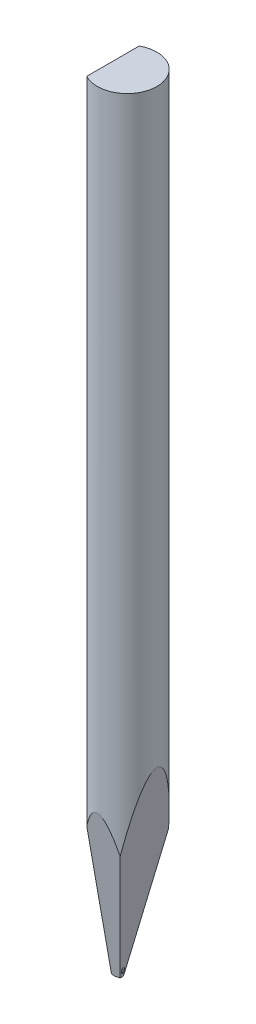
ISO-10303-21;
HEADER;
FILE_DESCRIPTION(('STEP AP214'),'2;1');
FILE_NAME('part.step','',(''),(''),'','','');
FILE_SCHEMA(('AUTOMOTIVE_DESIGN { 1 0 10303 214 1 1 1 1 }'));
ENDSEC;
DATA;
#1=APPLICATION_CONTEXT('core data for automotive mechanical design processes');
#2=APPLICATION_PROTOCOL_DEFINITION('international standard','automotive_design',2000,#1);
#3=PRODUCT_CONTEXT('',#1,'mechanical');
#4=PRODUCT('Part','Part','',(#3));
#5=PRODUCT_RELATED_PRODUCT_CATEGORY('part','',(#4));
#6=PRODUCT_DEFINITION_FORMATION('','',#4);
#7=PRODUCT_DEFINITION_CONTEXT('part definition',#1,'design');
#8=PRODUCT_DEFINITION('design','',#6,#7);
#9=PRODUCT_DEFINITION_SHAPE('','',#8);
#10=(LENGTH_UNIT() NAMED_UNIT(*) SI_UNIT(.MILLI.,.METRE.));
#11=(NAMED_UNIT(*) PLANE_ANGLE_UNIT() SI_UNIT($,.RADIAN.));
#12=(NAMED_UNIT(*) SI_UNIT($,.STERADIAN.) SOLID_ANGLE_UNIT());
#13=UNCERTAINTY_MEASURE_WITH_UNIT(LENGTH_MEASURE(1.E-05),#10,'distance_accuracy_value','');
#14=(GEOMETRIC_REPRESENTATION_CONTEXT(3) GLOBAL_UNCERTAINTY_ASSIGNED_CONTEXT((#13)) GLOBAL_UNIT_ASSIGNED_CONTEXT((#10,
#11,#12)) REPRESENTATION_CONTEXT('',''));
#15=CARTESIAN_POINT('',(0.,0.,0.));
#16=DIRECTION('',(0.,0.,1.));
#17=DIRECTION('',(1.,0.,0.));
#18=AXIS2_PLACEMENT_3D('',#15,#16,#17);
#19=CARTESIAN_POINT('',(26.8738719491216,0.,0.0381));
#20=DIRECTION('',(0.,-0.173648177666931,0.984807753012208));
#21=DIRECTION('',(0.,-0.984807753012208,-0.173648177666931));
#22=AXIS2_PLACEMENT_3D('',#19,#20,#21);
#23=PLANE('',#22);
#24=CARTESIAN_POINT('',(-0.3480816,0.02794,0.043026575840991));
#25=DIRECTION('',(0.,-0.173648177666931,0.984807753012208));
#26=DIRECTION('',(0.,-0.984807753012208,-0.173648177666931));
#27=AXIS2_PLACEMENT_3D('',#24,#25,#26);
#28=ELLIPSE('',#27,0.0283710195360877,0.02794);
#29=CARTESIAN_POINT('',(-0.3480816,0.,0.0380999999999965));
#30=VERTEX_POINT('',#29);
#31=CARTESIAN_POINT('',(-0.37592,0.0255594358987837,0.042606818160644));
#32=VERTEX_POINT('',#31);
#33=EDGE_CURVE('E533',#30,#32,#28,.F.);
#34=ORIENTED_EDGE('',*,*,#33,.F.);
#35=DIRECTION('',(-1.,0.,0.));
#36=VECTOR('',#35,1.);
#37=CARTESIAN_POINT('',(26.8738719491216,0.,0.0381));
#38=LINE('',#37,#36);
#39=CARTESIAN_POINT('',(-0.334515407893339,0.,0.0381));
#40=VERTEX_POINT('',#39);
#41=EDGE_CURVE('E458',#40,#30,#38,.T.);
#42=ORIENTED_EDGE('',*,*,#41,.F.);
#43=CARTESIAN_POINT('',(-0.322072,-0.00254,0.0376521294690005));
#44=DIRECTION('',(0.,-0.173648177666931,0.984807753012208));
#45=DIRECTION('',(0.,0.984807753012208,0.173648177666931));
#46=AXIS2_PLACEMENT_3D('',#43,#44,#45);
#47=ELLIPSE('',#46,0.0128959179709489,0.0127);
#48=CARTESIAN_POINT('',(-0.309628592106662,0.,0.0381));
#49=VERTEX_POINT('',#48);
#50=EDGE_CURVE('E548',#49,#40,#47,.T.);
#51=ORIENTED_EDGE('',*,*,#50,.F.);
#52=CARTESIAN_POINT('',(-0.287530031999994,0.,0.0381000000000001));
#53=VERTEX_POINT('',#52);
#54=EDGE_CURVE('E459',#53,#49,#38,.T.);
#55=ORIENTED_EDGE('',*,*,#54,.F.);
#56=DIRECTION('',(-0.969414129863488,-0.241702088926824,-0.0426185995713961));
#57=VECTOR('',#56,1.);
#58=CARTESIAN_POINT('',(25.2377710897047,6.36417235064545,1.16027529529761));
#59=LINE('',#58,#57);
#60=CARTESIAN_POINT('',(-0.14087245573118,0.0365658405929257,0.0445475442688178));
#61=VERTEX_POINT('',#60);
#62=EDGE_CURVE('E455',#61,#53,#59,.T.);
#63=ORIENTED_EDGE('',*,*,#62,.F.);
#64=DIRECTION('',(-0.171087869746036,-0.970287525247814,-0.171087869746036));
#65=VECTOR('',#64,1.);
#66=CARTESIAN_POINT('',(0.643618908501144,4.48563745221079,0.829038908501145));
#67=LINE('',#66,#65);
#68=CARTESIAN_POINT('',(0.459935574577413,3.44391749996237,0.645355574577413));
#69=VERTEX_POINT('',#68);
#70=EDGE_CURVE('E452',#69,#61,#67,.T.);
#71=ORIENTED_EDGE('',*,*,#70,.F.);
#72=CARTESIAN_POINT('',(0.,-0.216075837327433,0.));
#73=DIRECTION('',(0.,-0.173648177666931,0.984807753012208));
#74=DIRECTION('',(0.,-0.984807753012208,-0.173648177666931));
#75=AXIS2_PLACEMENT_3D('',#72,#73,#74);
#76=ELLIPSE('',#75,4.56371043248163,0.792479999999998);
#77=CARTESIAN_POINT('',(-0.37592,3.74046620982329,0.69764511322018));
#78=VERTEX_POINT('',#77);
#79=EDGE_CURVE('E466',#69,#78,#76,.T.);
#80=ORIENTED_EDGE('',*,*,#79,.T.);
#81=DIRECTION('',(0.,0.984807753012208,0.173648177666931));
#82=VECTOR('',#81,1.);
#83=CARTESIAN_POINT('',(-0.37592,20.2532840805181,3.60930043134861));
#84=LINE('',#83,#82);
#85=EDGE_CURVE('E54',#32,#78,#84,.T.);
#86=ORIENTED_EDGE('',*,*,#85,.F.);
#87=EDGE_LOOP('',(#34,#42,#51,#55,#63,#71,#80,#86));
#88=FACE_BOUND('',#87,.T.);
#89=ADVANCED_FACE('F46',(#88),#23,.T.);
#90=CARTESIAN_POINT('',(26.8738719491216,0.,-0.0381));
#91=DIRECTION('',(0.,-0.173648177666931,-0.984807753012208));
#92=DIRECTION('',(0.,0.984807753012208,-0.173648177666931));
#93=AXIS2_PLACEMENT_3D('',#90,#91,#92);
#94=PLANE('',#93);
#95=CARTESIAN_POINT('',(-0.3480816,0.02794,-0.0430265758409945));
#96=DIRECTION('',(0.,-0.173648177666931,-0.984807753012208));
#97=DIRECTION('',(0.,0.984807753012208,-0.173648177666931));
#98=AXIS2_PLACEMENT_3D('',#95,#96,#97);
#99=ELLIPSE('',#98,0.0283710195360877,0.02794);
#100=CARTESIAN_POINT('',(-0.37592,0.0255594358987768,-0.0426068181606431));
#101=VERTEX_POINT('',#100);
#102=CARTESIAN_POINT('',(-0.3480816,0.,-0.0381));
#103=VERTEX_POINT('',#102);
#104=EDGE_CURVE('E489',#101,#103,#99,.F.);
#105=ORIENTED_EDGE('',*,*,#104,.F.);
#106=DIRECTION('',(0.,-0.984807753012208,0.173648177666931));
#107=VECTOR('',#106,1.);
#108=CARTESIAN_POINT('',(-0.37592,20.5277483982937,-3.65769589581418));
#109=LINE('',#108,#107);
#110=CARTESIAN_POINT('',(-0.37592,3.74046620982329,-0.69764511322018));
#111=VERTEX_POINT('',#110);
#112=EDGE_CURVE('E219',#111,#101,#109,.T.);
#113=ORIENTED_EDGE('',*,*,#112,.F.);
#114=CARTESIAN_POINT('',(0.,-0.216075837327433,0.));
#115=DIRECTION('',(0.,-0.173648177666931,-0.984807753012208));
#116=DIRECTION('',(0.,-0.984807753012208,0.173648177666931));
#117=AXIS2_PLACEMENT_3D('',#114,#115,#116);
#118=ELLIPSE('',#117,4.56371043248163,0.792479999999998);
#119=CARTESIAN_POINT('',(0.459935574577413,3.44391749996237,-0.645355574577413));
#120=VERTEX_POINT('',#119);
#121=EDGE_CURVE('E469',#111,#120,#118,.T.);
#122=ORIENTED_EDGE('',*,*,#121,.T.);
#123=DIRECTION('',(0.171087869746036,0.970287525247814,-0.171087869746036));
#124=VECTOR('',#123,1.);
#125=CARTESIAN_POINT('',(0.643618908501144,4.48563745221079,-0.829038908501145));
#126=LINE('',#125,#124);
#127=CARTESIAN_POINT('',(-0.14087245573118,0.0365658405929257,-0.0445475442688178));
#128=VERTEX_POINT('',#127);
#129=EDGE_CURVE('E257',#128,#120,#126,.T.);
#130=ORIENTED_EDGE('',*,*,#129,.F.);
#131=DIRECTION('',(0.969414129863488,0.241702088926824,-0.0426185995713961));
#132=VECTOR('',#131,1.);
#133=CARTESIAN_POINT('',(25.2377710897047,6.36417235064545,-1.16027529529761));
#134=LINE('',#133,#132);
#135=CARTESIAN_POINT('',(-0.287530031999994,0.,-0.0381000000000001));
#136=VERTEX_POINT('',#135);
#137=EDGE_CURVE('E264',#136,#128,#134,.T.);
#138=ORIENTED_EDGE('',*,*,#137,.F.);
#139=DIRECTION('',(-1.,0.,0.));
#140=VECTOR('',#139,1.);
#141=CARTESIAN_POINT('',(26.8738719491216,0.,-0.0381));
#142=LINE('',#141,#140);
#143=CARTESIAN_POINT('',(-0.309628592106662,0.,-0.0381));
#144=VERTEX_POINT('',#143);
#145=EDGE_CURVE('E463',#136,#144,#142,.T.);
#146=ORIENTED_EDGE('',*,*,#145,.T.);
#147=CARTESIAN_POINT('',(-0.322072,-0.00254,-0.0376521294690005));
#148=DIRECTION('',(0.,-0.173648177666931,-0.984807753012208));
#149=DIRECTION('',(0.,-0.984807753012208,0.173648177666931));
#150=AXIS2_PLACEMENT_3D('',#147,#148,#149);
#151=ELLIPSE('',#150,0.0128959179709489,0.0127);
#152=CARTESIAN_POINT('',(-0.334515407893338,0.,-0.0381));
#153=VERTEX_POINT('',#152);
#154=EDGE_CURVE('E539',#153,#144,#151,.T.);
#155=ORIENTED_EDGE('',*,*,#154,.F.);
#156=EDGE_CURVE('E462',#153,#103,#142,.T.);
#157=ORIENTED_EDGE('',*,*,#156,.T.);
#158=EDGE_LOOP('',(#105,#113,#122,#130,#138,#146,#155,#157));
#159=FACE_BOUND('',#158,.T.);
#160=ADVANCED_FACE('F352',(#159),#94,.T.);
#161=CARTESIAN_POINT('',(0.,0.,0.));
#162=DIRECTION('',(0.,1.,0.));
#163=DIRECTION('',(0.,0.,1.));
#164=AXIS2_PLACEMENT_3D('',#161,#162,#163);
#165=PLANE('',#164);
#166=ORIENTED_EDGE('',*,*,#41,.T.);
#167=DIRECTION('',(0.,0.,-1.));
#168=VECTOR('',#167,1.);
#169=CARTESIAN_POINT('',(-0.3480816,0.,26.4495986754137));
#170=LINE('',#169,#168);
#171=CARTESIAN_POINT('',(-0.348081600000001,0.,0.0305592719154106));
#172=VERTEX_POINT('',#171);
#173=EDGE_CURVE('E76',#30,#172,#170,.T.);
#174=ORIENTED_EDGE('',*,*,#173,.T.);
#175=DIRECTION('',(-1.,0.,0.));
#176=VECTOR('',#175,1.);
#177=CARTESIAN_POINT('',(26.7633844891216,0.,0.0305592719154106));
#178=LINE('',#177,#176);
#179=CARTESIAN_POINT('',(-0.334515407893338,0.,0.0305592719154164));
#180=VERTEX_POINT('',#179);
#181=EDGE_CURVE('E314',#180,#172,#178,.T.);
#182=ORIENTED_EDGE('',*,*,#181,.F.);
#183=DIRECTION('',(0.,0.,1.));
#184=VECTOR('',#183,1.);
#185=CARTESIAN_POINT('',(-0.334515407893339,0.,-0.792479999999998));
#186=LINE('',#185,#184);
#187=EDGE_CURVE('E545',#180,#40,#186,.T.);
#188=ORIENTED_EDGE('',*,*,#187,.T.);
#189=EDGE_LOOP('',(#166,#174,#182,#188));
#190=FACE_BOUND('',#189,.T.);
#191=ADVANCED_FACE('F363',(#190),#165,.F.);
#192=DIRECTION('',(-1.,0.,0.));
#193=VECTOR('',#192,1.);
#194=CARTESIAN_POINT('',(26.7633844891216,0.,-0.0305592719154106));
#195=LINE('',#194,#193);
#196=CARTESIAN_POINT('',(-0.334515407893339,0.,-0.0305592719154028));
#197=VERTEX_POINT('',#196);
#198=CARTESIAN_POINT('',(-0.348081600000025,0.,-0.0305592719154106));
#199=VERTEX_POINT('',#198);
#200=EDGE_CURVE('E339',#197,#199,#195,.T.);
#201=ORIENTED_EDGE('',*,*,#200,.T.);
#202=EDGE_CURVE('E500',#199,#103,#170,.T.);
#203=ORIENTED_EDGE('',*,*,#202,.T.);
#204=ORIENTED_EDGE('',*,*,#156,.F.);
#205=DIRECTION('',(0.,0.,1.));
#206=VECTOR('',#205,1.);
#207=CARTESIAN_POINT('',(-0.334515407893339,0.,-0.792479999999998));
#208=LINE('',#207,#206);
#209=EDGE_CURVE('E504',#153,#197,#208,.T.);
#210=ORIENTED_EDGE('',*,*,#209,.T.);
#211=EDGE_LOOP('',(#201,#203,#204,#210));
#212=FACE_BOUND('',#211,.T.);
#213=ADVANCED_FACE('F502',(#212),#165,.F.);
#214=CARTESIAN_POINT('',(26.7633844891216,-0.12065,0.));
#215=DIRECTION('',(-1.,0.,0.));
#216=DIRECTION('',(0.,0.,1.));
#217=AXIS2_PLACEMENT_3D('',#214,#215,#216);
#218=CYLINDRICAL_SURFACE('',#217,0.12446);
#219=ORIENTED_EDGE('',*,*,#181,.T.);
#220=CARTESIAN_POINT('',(-0.3480816,0.,0.0305592719154105));
#221=CARTESIAN_POINT('',(-0.348532414510365,-4.07901574040078E-07,0.030560581386463));
#222=CARTESIAN_POINT('',(-0.348981513015498,1.08939864350078E-05,0.0305162789202462));
#223=CARTESIAN_POINT('',(-0.349858579795944,5.32586660467856E-05,0.0303484247483052));
#224=CARTESIAN_POINT('',(-0.350286731865883,8.4092359650405E-05,0.0302257916828264));
#225=CARTESIAN_POINT('',(-0.351113362424043,0.000161841460247106,0.0299134495677684));
#226=CARTESIAN_POINT('',(-0.35151196202256,0.000208686245204147,0.0297240349657199));
#227=CARTESIAN_POINT('',(-0.352278140220125,0.000314247686217247,0.0292915141713725));
#228=CARTESIAN_POINT('',(-0.352645619029946,0.000373000623511617,0.0290482436791141));
#229=CARTESIAN_POINT('',(-0.35359420997671,0.000542464303569315,0.0283352771344449));
#230=CARTESIAN_POINT('',(-0.354144423136007,0.000660718500815404,0.0278264292093539));
#231=CARTESIAN_POINT('',(-0.355160085849612,0.000906480045084555,0.0267326241717186));
#232=CARTESIAN_POINT('',(-0.355625292710967,0.00103401247561457,0.0261474570746374));
#233=CARTESIAN_POINT('',(-0.356838867127968,0.00139509322037671,0.0244246652655094));
#234=CARTESIAN_POINT('',(-0.357504425120584,0.00162934905892231,0.0232293596959634));
#235=CARTESIAN_POINT('',(-0.358662354617674,0.00207372872141359,0.0207553925747935));
#236=CARTESIAN_POINT('',(-0.359154298197641,0.00228379206987272,0.0194765341416027));
#237=CARTESIAN_POINT('',(-0.360409347015515,0.00284958434009627,0.0156411550182059));
#238=CARTESIAN_POINT('',(-0.36099020245078,0.00315568845104644,0.0130178775361366));
#239=CARTESIAN_POINT('',(-0.361807763735845,0.00360035199279561,0.00770331230595079));
#240=CARTESIAN_POINT('',(-0.36204332222154,0.00373835258818454,0.00501182791339609));
#241=CARTESIAN_POINT('',(-0.362223759422928,0.00384312710698279,-0.000626307070876753));
#242=CARTESIAN_POINT('',(-0.36214064346317,0.00379341669557655,-0.00357417277696257));
#243=CARTESIAN_POINT('',(-0.361603303147984,0.00348744188955589,-0.00941520395435196));
#244=CARTESIAN_POINT('',(-0.361151065589905,0.0032322834184699,-0.012308577633631));
#245=CARTESIAN_POINT('',(-0.36020348125309,0.00276522394072263,-0.0161243719322494));
#246=CARTESIAN_POINT('',(-0.359925161043642,0.00263206670725187,-0.0171113029226895));
#247=CARTESIAN_POINT('',(-0.359292691592361,0.00234550293162332,-0.0190622381461491));
#248=CARTESIAN_POINT('',(-0.358938264817202,0.00219202308728154,-0.0200261437209164));
#249=CARTESIAN_POINT('',(-0.358021790944629,0.00182196264864307,-0.0221910750494553));
#250=CARTESIAN_POINT('',(-0.357429338543759,0.00160009037378357,-0.0233785738678674));
#251=CARTESIAN_POINT('',(-0.35604278567997,0.00114822728257267,-0.0256274014231809));
#252=CARTESIAN_POINT('',(-0.355250212179878,0.000918308819138199,-0.0266895999907209));
#253=CARTESIAN_POINT('',(-0.353971194547941,0.000625501592056409,-0.0279764742692895));
#254=CARTESIAN_POINT('',(-0.3536002235946,0.000547541257565031,-0.0283116735867207));
#255=CARTESIAN_POINT('',(-0.352815445163367,0.000401035258664706,-0.0289316105181179));
#256=CARTESIAN_POINT('',(-0.352401615965379,0.000332494409297512,-0.0292163223453751));
#257=CARTESIAN_POINT('',(-0.351525748851535,0.000209524327573208,-0.0297209697927632));
#258=CARTESIAN_POINT('',(-0.351063129273438,0.000155300800887523,-0.0299399667559688));
#259=CARTESIAN_POINT('',(-0.350103096573157,6.91140443387769E-05,-0.0302856380011849));
#260=CARTESIAN_POINT('',(-0.349605828801305,3.70633361957212E-05,-0.0304126751846483));
#261=CARTESIAN_POINT('',(-0.348932389757914,1.24370193427961E-05,-0.0305101337557272));
#262=CARTESIAN_POINT('',(-0.348762851457124,7.78649892715044E-06,-0.0305285162109277));
#263=CARTESIAN_POINT('',(-0.348422776485652,1.56788977351648E-06,-0.0305530840375709));
#264=CARTESIAN_POINT('',(-0.348252239475355,9.18970778692699E-10,-0.0305592649853821));
#265=CARTESIAN_POINT('',(-0.348081600000024,0.,-0.030559271915578));
#266=B_SPLINE_CURVE_WITH_KNOTS('',3,(#220,#221,#222,#223,#224,#225,#226,#227,#228,#229,#230,
#231,#232,#233,#234,#235,#236,#237,#238,#239,#240,#241,#242,#243,#244,#245,#246,#247,#248,#249,
#250,#251,#252,#253,#254,#255,#256,#257,#258,#259,#260,#261,#262,#263,#264,#265),.UNSPECIFIED.,
.F.,.F.,(4,2,2,2,2,2,2,2,2,2,2,2,2,2,2,2,2,2,2,2,2,2,4),(0.,0.00134741004079461,
0.00267930111383518,0.00400539168870561,0.00533558497102563,0.00759858100655783,
0.00986794025134445,0.0140085166125739,0.0181592285296349,0.0262271883926921,0.0343218964424841,
0.0431433167180624,0.0519175663828151,0.0550173321670142,0.0581285996977545,0.0621538633051512,
0.0661492954960445,0.0676639727026712,0.0691794213229799,0.070715585340381,0.0722456536356834,
0.0727570681004664,0.0732686679434899),.UNSPECIFIED.);
#267=CARTESIAN_POINT('',(-0.359942945830785,0.00265097038778909,0.0169378903533419));
#268=VERTEX_POINT('',#267);
#269=EDGE_CURVE('E492',#172,#268,#266,.T.);
#270=ORIENTED_EDGE('',*,*,#269,.T.);
#271=CARTESIAN_POINT('',(-0.37592,0.,-0.0305592719154106));
#272=CARTESIAN_POINT('',(-0.363216800126761,0.00252588537008305,-0.0205869116201759));
#273=CARTESIAN_POINT('',(-0.35052,0.00381,-0.0102906602127608));
#274=CARTESIAN_POINT('',(-0.35052,0.00381000000000001,0.0102906602127608));
#275=CARTESIAN_POINT('',(-0.363216800126761,0.00252588537008312,0.0205869116201756));
#276=CARTESIAN_POINT('',(-0.37592,0.,0.0305592719154105));
#277=(BOUNDED_CURVE() B_SPLINE_CURVE(3,(#271,#272,#273,#274,#275,#276),.UNSPECIFIED.,.F.,
.F.) B_SPLINE_CURVE_WITH_KNOTS((4,2,4),(1.32272489561682,1.5707963267949,1.81886775797297),
.UNSPECIFIED.) CURVE() GEOMETRIC_REPRESENTATION_ITEM() RATIONAL_B_SPLINE_CURVE((1.,1.,1.,1.,1.,1.)) REPRESENTATION_ITEM(''));
#278=CARTESIAN_POINT('',(-0.359942874051243,0.00265097235447917,-0.0169378760211834));
#279=VERTEX_POINT('',#278);
#280=EDGE_CURVE('E212',#268,#279,#277,.F.);
#281=ORIENTED_EDGE('',*,*,#280,.T.);
#282=EDGE_CURVE('E68',#279,#199,#266,.T.);
#283=ORIENTED_EDGE('',*,*,#282,.T.);
#284=ORIENTED_EDGE('',*,*,#200,.F.);
#285=CARTESIAN_POINT('',(-0.334515407893338,0.,-0.0305592719154106));
#286=CARTESIAN_POINT('',(-0.334288327913438,0.00105243169925074,-0.0264031052443461));
#287=CARTESIAN_POINT('',(-0.333990605303639,0.00188980017528761,-0.0221949953116037));
#288=CARTESIAN_POINT('',(-0.33346426385006,0.00311789267734804,-0.0137728980843957));
#289=CARTESIAN_POINT('',(-0.333234707035479,0.00351490695054527,-0.00955987772849091));
#290=CARTESIAN_POINT('',(-0.332995890386607,0.00395111488967416,0.000639045577207835));
#291=CARTESIAN_POINT('',(-0.333116413429122,0.00377540428709342,0.0066400145372672));
#292=CARTESIAN_POINT('',(-0.333567058332922,0.00286461390504645,0.0156148063316251));
#293=CARTESIAN_POINT('',(-0.333765849687008,0.00244511991813497,0.0186337975635508));
#294=CARTESIAN_POINT('',(-0.334163528099095,0.00138643288687232,0.0246292163558154));
#295=CARTESIAN_POINT('',(-0.334362414746053,0.000747507891821952,0.0276056912534015));
#296=CARTESIAN_POINT('',(-0.334515407910335,0.,0.0305592719158305));
#297=B_SPLINE_CURVE_WITH_KNOTS('',3,(#285,#286,#287,#288,#289,#290,#291,#292,#293,#294,#295,
#296),.UNSPECIFIED.,.F.,.F.,(4,2,2,2,2,4),(0.,0.0128774044276926,0.0255683926066268,
0.0434897610181716,0.0526466447761179,0.0617923823563098),.UNSPECIFIED.);
#298=EDGE_CURVE('E292',#197,#180,#297,.T.);
#299=ORIENTED_EDGE('',*,*,#298,.T.);
#300=EDGE_LOOP('',(#219,#270,#281,#283,#284,#299));
#301=FACE_BOUND('',#300,.T.);
#302=ADVANCED_FACE('F304',(#301),#218,.F.);
#303=CARTESIAN_POINT('',(-0.287530032,0.,0.0305592719154167));
#304=VERTEX_POINT('',#303);
#305=CARTESIAN_POINT('',(-0.309628592106661,0.,0.0305592719154164));
#306=VERTEX_POINT('',#305);
#307=EDGE_CURVE('E507',#304,#306,#178,.T.);
#308=ORIENTED_EDGE('',*,*,#307,.T.);
#309=CARTESIAN_POINT('',(-0.309628592106661,0.,0.0305592719154164));
#310=CARTESIAN_POINT('',(-0.309855672086562,0.00105243169924949,0.0264031052443519));
#311=CARTESIAN_POINT('',(-0.31015339469636,0.00188980017528656,0.0221949953116096));
#312=CARTESIAN_POINT('',(-0.310679736149939,0.00311789267734738,0.0137728980844017));
#313=CARTESIAN_POINT('',(-0.310909292964521,0.00351490695054479,0.0095598777284969));
#314=CARTESIAN_POINT('',(-0.311148109613393,0.00395111488967416,-0.00063904557720183));
#315=CARTESIAN_POINT('',(-0.311027586570878,0.00377540428709371,-0.00664001453726121));
#316=CARTESIAN_POINT('',(-0.310576941667078,0.00286461390504719,-0.0156148063316192));
#317=CARTESIAN_POINT('',(-0.310378150312992,0.00244511991813587,-0.0186337975635449));
#318=CARTESIAN_POINT('',(-0.309980471900906,0.00138643288687351,-0.0246292163558095));
#319=CARTESIAN_POINT('',(-0.309781585253947,0.000747507891823294,-0.0276056912533957));
#320=CARTESIAN_POINT('',(-0.309628592089665,0.,-0.0305592719158247));
#321=B_SPLINE_CURVE_WITH_KNOTS('',3,(#309,#310,#311,#312,#313,#314,#315,#316,#317,#318,#319,
#320),.UNSPECIFIED.,.F.,.F.,(4,2,2,2,2,4),(0.,0.0128774044276926,0.0255683926066268,
0.0434897610181716,0.0526466447761179,0.0617923823563099),.UNSPECIFIED.);
#322=CARTESIAN_POINT('',(-0.310348438172682,0.00234345145169317,0.0190499999999999));
#323=VERTEX_POINT('',#322);
#324=EDGE_CURVE('E291',#306,#323,#321,.T.);
#325=ORIENTED_EDGE('',*,*,#324,.T.);
#326=DIRECTION('',(-1.,0.,0.));
#327=VECTOR('',#326,1.);
#328=CARTESIAN_POINT('',(26.7633844891216,0.00234345145169317,0.01905));
#329=LINE('',#328,#327);
#330=CARTESIAN_POINT('',(-0.278130961598888,0.00234345145169256,0.0190499999999998));
#331=VERTEX_POINT('',#330);
#332=EDGE_CURVE('E519',#323,#331,#329,.F.);
#333=ORIENTED_EDGE('',*,*,#332,.T.);
#334=CARTESIAN_POINT('',(-0.771430751631098,-0.12065,0.));
#335=DIRECTION('',(-0.241921895599669,0.970295726275996,0.));
#336=DIRECTION('',(-0.970295726275996,-0.241921895599669,0.));
#337=AXIS2_PLACEMENT_3D('',#334,#335,#336);
#338=ELLIPSE('',#337,0.514463561437845,0.12446);
#339=EDGE_CURVE('E416',#304,#331,#338,.T.);
#340=ORIENTED_EDGE('',*,*,#339,.F.);
#341=EDGE_LOOP('',(#308,#325,#333,#340));
#342=FACE_BOUND('',#341,.T.);
#343=ADVANCED_FACE('F564',(#342),#218,.F.);
#344=CARTESIAN_POINT('',(-0.396900039485001,-0.12065,0.));
#345=DIRECTION('',(0.819152044288989,-0.57357643635105,0.));
#346=DIRECTION('',(-0.57357643635105,-0.819152044288989,0.));
#347=AXIS2_PLACEMENT_3D('',#344,#345,#346);
#348=ELLIPSE('',#347,0.151937605317251,0.12446);
#349=CARTESIAN_POINT('',(-0.310513647030696,0.00272255419325839,-0.0164165913584926));
#350=VERTEX_POINT('',#349);
#351=CARTESIAN_POINT('',(-0.310513647030707,0.00272255419328185,0.0164165913583099));
#352=VERTEX_POINT('',#351);
#353=EDGE_CURVE('E280',#350,#352,#348,.T.);
#354=ORIENTED_EDGE('',*,*,#353,.T.);
#355=EDGE_CURVE('E290',#352,#350,#321,.T.);
#356=ORIENTED_EDGE('',*,*,#355,.T.);
#357=EDGE_LOOP('',(#354,#356));
#358=FACE_BOUND('',#357,.T.);
#359=ADVANCED_FACE('F305',(#358),#218,.F.);
#360=ORIENTED_EDGE('',*,*,#54,.T.);
#361=DIRECTION('',(0.,0.,1.));
#362=VECTOR('',#361,1.);
#363=CARTESIAN_POINT('',(-0.309628592106662,0.,-0.792479999999998));
#364=LINE('',#363,#362);
#365=EDGE_CURVE('E514',#49,#306,#364,.F.);
#366=ORIENTED_EDGE('',*,*,#365,.T.);
#367=ORIENTED_EDGE('',*,*,#307,.F.);
#368=DIRECTION('',(0.,0.,-1.));
#369=VECTOR('',#368,1.);
#370=CARTESIAN_POINT('',(-0.287530032,0.,27.2760283406468));
#371=LINE('',#370,#369);
#372=EDGE_CURVE('E446',#53,#304,#371,.T.);
#373=ORIENTED_EDGE('',*,*,#372,.F.);
#374=EDGE_LOOP('',(#360,#366,#367,#373));
#375=FACE_BOUND('',#374,.T.);
#376=ADVANCED_FACE('F361',(#375),#165,.F.);
#377=CARTESIAN_POINT('',(-0.287530032,0.,-0.0305592719154028));
#378=VERTEX_POINT('',#377);
#379=CARTESIAN_POINT('',(-0.309628592106661,0.,-0.0305592719154106));
#380=VERTEX_POINT('',#379);
#381=EDGE_CURVE('E506',#378,#380,#195,.T.);
#382=ORIENTED_EDGE('',*,*,#381,.T.);
#383=DIRECTION('',(0.,0.,1.));
#384=VECTOR('',#383,1.);
#385=CARTESIAN_POINT('',(-0.309628592106662,0.,-0.792479999999998));
#386=LINE('',#385,#384);
#387=EDGE_CURVE('E532',#380,#144,#386,.F.);
#388=ORIENTED_EDGE('',*,*,#387,.T.);
#389=ORIENTED_EDGE('',*,*,#145,.F.);
#390=EDGE_CURVE('E445',#378,#136,#371,.T.);
#391=ORIENTED_EDGE('',*,*,#390,.F.);
#392=EDGE_LOOP('',(#382,#388,#389,#391));
#393=FACE_BOUND('',#392,.T.);
#394=ADVANCED_FACE('F358',(#393),#165,.F.);
#395=CARTESIAN_POINT('',(-0.287530032,0.,27.2760283406468));
#396=DIRECTION('',(-0.241921895599669,0.970295726275996,0.));
#397=DIRECTION('',(-0.970295726275996,-0.241921895599669,0.));
#398=AXIS2_PLACEMENT_3D('',#395,#396,#397);
#399=PLANE('',#398);
#400=ORIENTED_EDGE('',*,*,#372,.T.);
#401=ORIENTED_EDGE('',*,*,#339,.T.);
#402=DIRECTION('',(-0.970295726275996,-0.241921895599669,0.));
#403=VECTOR('',#402,1.);
#404=CARTESIAN_POINT('',(-0.287530032,0.,0.0190499999999996));
#405=LINE('',#404,#403);
#406=CARTESIAN_POINT('',(-0.193550032,0.0234318457072022,0.0190499999999998));
#407=VERTEX_POINT('',#406);
#408=EDGE_CURVE('E277',#407,#331,#405,.T.);
#409=ORIENTED_EDGE('',*,*,#408,.F.);
#410=DIRECTION('',(0.,0.,1.));
#411=VECTOR('',#410,1.);
#412=CARTESIAN_POINT('',(-0.193550032,0.0234318457072022,27.2760283406468));
#413=LINE('',#412,#411);
#414=CARTESIAN_POINT('',(-0.193550032,0.0234318457072022,-0.0190499999999998));
#415=VERTEX_POINT('',#414);
#416=EDGE_CURVE('E275',#415,#407,#413,.T.);
#417=ORIENTED_EDGE('',*,*,#416,.F.);
#418=DIRECTION('',(-0.970295726275996,-0.241921895599669,0.));
#419=VECTOR('',#418,1.);
#420=CARTESIAN_POINT('',(-0.287530032,0.,-0.0190499999999996));
#421=LINE('',#420,#419);
#422=CARTESIAN_POINT('',(-0.278130961598888,0.00234345145169256,-0.0190499999999998));
#423=VERTEX_POINT('',#422);
#424=EDGE_CURVE('E267',#415,#423,#421,.T.);
#425=ORIENTED_EDGE('',*,*,#424,.T.);
#426=EDGE_CURVE('E420',#423,#378,#338,.T.);
#427=ORIENTED_EDGE('',*,*,#426,.T.);
#428=ORIENTED_EDGE('',*,*,#390,.T.);
#429=ORIENTED_EDGE('',*,*,#137,.T.);
#430=DIRECTION('',(0.,0.,-1.));
#431=VECTOR('',#430,1.);
#432=CARTESIAN_POINT('',(-0.140872455731182,0.0365658405929259,27.2760283406468));
#433=LINE('',#432,#431);
#434=EDGE_CURVE('E271',#61,#128,#433,.T.);
#435=ORIENTED_EDGE('',*,*,#434,.F.);
#436=ORIENTED_EDGE('',*,*,#62,.T.);
#437=EDGE_LOOP('',(#400,#401,#409,#417,#425,#427,#428,#429,#435,#436));
#438=FACE_BOUND('',#437,.T.);
#439=ADVANCED_FACE('F360',(#438),#399,.F.);
#440=CARTESIAN_POINT('',(0.,21.0312,0.));
#441=DIRECTION('',(0.,-1.,0.));
#442=DIRECTION('',(0.,0.,-1.));
#443=AXIS2_PLACEMENT_3D('',#440,#441,#442);
#444=CYLINDRICAL_SURFACE('',#443,0.792479999999998);
#445=ORIENTED_EDGE('',*,*,#79,.F.);
#446=CARTESIAN_POINT('',(0.,0.835493237666081,0.));
#447=DIRECTION('',(-0.984807753012208,0.173648177666931,0.));
#448=DIRECTION('',(-0.173648177666931,-0.984807753012208,0.));
#449=AXIS2_PLACEMENT_3D('',#446,#447,#448);
#450=ELLIPSE('',#449,4.56371043248165,0.792479999999998);
#451=EDGE_CURVE('E449',#69,#120,#450,.T.);
#452=ORIENTED_EDGE('',*,*,#451,.T.);
#453=ORIENTED_EDGE('',*,*,#121,.F.);
#454=DIRECTION('',(0.,-1.,0.));
#455=VECTOR('',#454,1.);
#456=CARTESIAN_POINT('',(-0.37592,21.0312,-0.69764511322018));
#457=LINE('',#456,#455);
#458=CARTESIAN_POINT('',(-0.37592,21.0312,-0.69764511322018));
#459=VERTEX_POINT('',#458);
#460=EDGE_CURVE('E475',#459,#111,#457,.T.);
#461=ORIENTED_EDGE('',*,*,#460,.F.);
#462=CARTESIAN_POINT('',(0.,21.0312,0.));
#463=DIRECTION('',(0.,1.,0.));
#464=DIRECTION('',(0.,0.,1.));
#465=AXIS2_PLACEMENT_3D('',#462,#463,#464);
#466=CIRCLE('',#465,0.792479999999998);
#467=CARTESIAN_POINT('',(-0.37592,21.0312,0.69764511322018));
#468=VERTEX_POINT('',#467);
#469=EDGE_CURVE('E476',#468,#459,#466,.T.);
#470=ORIENTED_EDGE('',*,*,#469,.F.);
#471=DIRECTION('',(0.,-1.,0.));
#472=VECTOR('',#471,1.);
#473=CARTESIAN_POINT('',(-0.37592,21.0312,0.69764511322018));
#474=LINE('',#473,#472);
#475=EDGE_CURVE('E473',#78,#468,#474,.F.);
#476=ORIENTED_EDGE('',*,*,#475,.F.);
#477=EDGE_LOOP('',(#445,#452,#453,#461,#470,#476));
#478=FACE_BOUND('',#477,.T.);
#479=ADVANCED_FACE('F351',(#478),#444,.T.);
#480=CARTESIAN_POINT('',(-0.37592,21.0312,-0.80247998));
#481=DIRECTION('',(-1.,0.,0.));
#482=DIRECTION('',(0.,0.,1.));
#483=AXIS2_PLACEMENT_3D('',#480,#481,#482);
#484=PLANE('',#483);
#485=CARTESIAN_POINT('',(-0.37592,0.,0.0305592719154105));
#486=CARTESIAN_POINT('',(-0.37592,0.0146958072941772,0.0237730502945856));
#487=CARTESIAN_POINT('',(-0.37592,0.0292100000000017,0.0123620164096919));
#488=CARTESIAN_POINT('',(-0.37592,0.0292100000000017,-0.0123620164096919));
#489=CARTESIAN_POINT('',(-0.37592,0.0146958072941776,-0.0237730502945864));
#490=CARTESIAN_POINT('',(-0.37592,0.,-0.0305592719154106));
#491=(BOUNDED_CURVE() B_SPLINE_CURVE(3,(#485,#486,#487,#488,#489,#490),.UNSPECIFIED.,.F.,
.F.) B_SPLINE_CURVE_WITH_KNOTS((4,2,4),(1.32272489561682,1.5707963267949,1.81886775797297),
.UNSPECIFIED.) CURVE() GEOMETRIC_REPRESENTATION_ITEM() RATIONAL_B_SPLINE_CURVE((1.,1.,1.,1.,1.,1.)) REPRESENTATION_ITEM(''));
#492=CARTESIAN_POINT('',(-0.37592000000032,0.025559394396128,-0.0110393991774743));
#493=VERTEX_POINT('',#492);
#494=CARTESIAN_POINT('',(-0.37592,0.0255593510681847,0.0109420294245952));
#495=VERTEX_POINT('',#494);
#496=EDGE_CURVE('E205',#493,#495,#491,.F.);
#497=ORIENTED_EDGE('',*,*,#496,.T.);
#498=DIRECTION('',(0.,0.,-1.));
#499=VECTOR('',#498,1.);
#500=CARTESIAN_POINT('',(-0.37592,0.0255594358987817,26.4495986754137));
#501=LINE('',#500,#499);
#502=EDGE_CURVE('E482',#32,#495,#501,.T.);
#503=ORIENTED_EDGE('',*,*,#502,.F.);
#504=ORIENTED_EDGE('',*,*,#85,.T.);
#505=ORIENTED_EDGE('',*,*,#475,.T.);
#506=DIRECTION('',(0.,0.,-1.));
#507=VECTOR('',#506,1.);
#508=CARTESIAN_POINT('',(-0.37592,21.0312,-0.80247998));
#509=LINE('',#508,#507);
#510=EDGE_CURVE('E471',#468,#459,#509,.T.);
#511=ORIENTED_EDGE('',*,*,#510,.T.);
#512=ORIENTED_EDGE('',*,*,#460,.T.);
#513=ORIENTED_EDGE('',*,*,#112,.T.);
#514=EDGE_CURVE('E216',#493,#101,#501,.T.);
#515=ORIENTED_EDGE('',*,*,#514,.F.);
#516=EDGE_LOOP('',(#497,#503,#504,#505,#511,#512,#513,#515));
#517=FACE_BOUND('',#516,.T.);
#518=ADVANCED_FACE('F217',(#517),#484,.T.);
#519=CARTESIAN_POINT('',(0.,21.0312,0.));
#520=DIRECTION('',(0.,1.,0.));
#521=DIRECTION('',(0.,0.,1.));
#522=AXIS2_PLACEMENT_3D('',#519,#520,#521);
#523=PLANE('',#522);
#524=ORIENTED_EDGE('',*,*,#469,.T.);
#525=ORIENTED_EDGE('',*,*,#510,.F.);
#526=EDGE_LOOP('',(#524,#525));
#527=FACE_BOUND('',#526,.T.);
#528=ADVANCED_FACE('F350',(#527),#523,.T.);
#529=CARTESIAN_POINT('',(-0.140872455731182,0.0365658405929259,27.2760283406468));
#530=DIRECTION('',(-0.984807753012208,0.173648177666931,0.));
#531=DIRECTION('',(-0.173648177666931,-0.984807753012208,0.));
#532=AXIS2_PLACEMENT_3D('',#529,#530,#531);
#533=PLANE('',#532);
#534=CARTESIAN_POINT('',(-0.111620104021223,0.202464171026684,0.));
#535=DIRECTION('',(-0.984807753012208,0.173648177666931,0.));
#536=DIRECTION('',(0.173648177666931,0.984807753012208,0.));
#537=AXIS2_PLACEMENT_3D('',#534,#535,#536);
#538=ELLIPSE('',#537,0.0818055511972642,0.0378312246736476);
#539=CARTESIAN_POINT('',(-0.0974147191327789,0.283026912085186,0.));
#540=VERTEX_POINT('',#539);
#541=EDGE_CURVE('E268',#540,#540,#538,.F.);
#542=ORIENTED_EDGE('',*,*,#541,.F.);
#543=EDGE_LOOP('',(#542));
#544=FACE_BOUND('',#543,.T.);
#545=ORIENTED_EDGE('',*,*,#451,.F.);
#546=ORIENTED_EDGE('',*,*,#70,.T.);
#547=ORIENTED_EDGE('',*,*,#434,.T.);
#548=ORIENTED_EDGE('',*,*,#129,.T.);
#549=EDGE_LOOP('',(#545,#546,#547,#548));
#550=FACE_BOUND('',#549,.T.);
#551=ADVANCED_FACE('F356',(#544,#550),#533,.F.);
#552=CARTESIAN_POINT('',(-0.193550032,0.0812800000000001,0.01905));
#553=DIRECTION('',(-1.,0.,0.));
#554=DIRECTION('',(0.,0.,1.));
#555=AXIS2_PLACEMENT_3D('',#552,#553,#554);
#556=PLANE('',#555);
#557=ORIENTED_EDGE('',*,*,#416,.T.);
#558=DIRECTION('',(0.,1.,0.));
#559=VECTOR('',#558,1.);
#560=CARTESIAN_POINT('',(-0.193550032,0.0812800000000001,0.01905));
#561=LINE('',#560,#559);
#562=CARTESIAN_POINT('',(-0.193550032,0.0812800000000001,0.01905));
#563=VERTEX_POINT('',#562);
#564=EDGE_CURVE('E433',#407,#563,#561,.T.);
#565=ORIENTED_EDGE('',*,*,#564,.T.);
#566=CARTESIAN_POINT('',(-0.193550032,0.0812800000000002,0.));
#567=DIRECTION('',(1.,0.,0.));
#568=DIRECTION('',(0.,1.,0.));
#569=AXIS2_PLACEMENT_3D('',#566,#567,#568);
#570=ELLIPSE('',#569,0.0269407683632073,0.01905);
#571=CARTESIAN_POINT('',(-0.193550032,0.0812800000000001,-0.0190499999999996));
#572=VERTEX_POINT('',#571);
#573=EDGE_CURVE('E409',#572,#563,#570,.F.);
#574=ORIENTED_EDGE('',*,*,#573,.F.);
#575=DIRECTION('',(0.,1.,0.));
#576=VECTOR('',#575,1.);
#577=CARTESIAN_POINT('',(-0.193550032,0.0812800000000001,-0.01905));
#578=LINE('',#577,#576);
#579=EDGE_CURVE('E430',#415,#572,#578,.T.);
#580=ORIENTED_EDGE('',*,*,#579,.F.);
#581=EDGE_LOOP('',(#557,#565,#574,#580));
#582=FACE_BOUND('',#581,.T.);
#583=ADVANCED_FACE('F381',(#582),#556,.T.);
#584=CARTESIAN_POINT('',(0.,0.,0.01905));
#585=DIRECTION('',(0.,0.,-1.));
#586=DIRECTION('',(-1.,0.,0.));
#587=AXIS2_PLACEMENT_3D('',#584,#585,#586);
#588=PLANE('',#587);
#589=CARTESIAN_POINT('',(-0.322072,-0.00254,0.0190499999999999));
#590=DIRECTION('',(0.,0.,-1.));
#591=DIRECTION('',(-1.,0.,0.));
#592=AXIS2_PLACEMENT_3D('',#589,#590,#591);
#593=CIRCLE('',#592,0.0127);
#594=CARTESIAN_POINT('',(-0.310513647030696,0.00272255419325839,0.0190499999999999));
#595=VERTEX_POINT('',#594);
#596=EDGE_CURVE('E543',#595,#323,#593,.T.);
#597=ORIENTED_EDGE('',*,*,#596,.F.);
#598=DIRECTION('',(-0.57357643635105,-0.819152044288989,0.));
#599=VECTOR('',#598,1.);
#600=CARTESIAN_POINT('',(-0.31242,0.,0.01905));
#601=LINE('',#600,#599);
#602=CARTESIAN_POINT('',(-0.255507131294314,0.0812800000000001,0.01905));
#603=VERTEX_POINT('',#602);
#604=EDGE_CURVE('E429',#603,#595,#601,.T.);
#605=ORIENTED_EDGE('',*,*,#604,.F.);
#606=DIRECTION('',(-1.,0.,0.));
#607=VECTOR('',#606,1.);
#608=CARTESIAN_POINT('',(-0.255507131294314,0.0812800000000001,0.01905));
#609=LINE('',#608,#607);
#610=EDGE_CURVE('E426',#563,#603,#609,.T.);
#611=ORIENTED_EDGE('',*,*,#610,.F.);
#612=ORIENTED_EDGE('',*,*,#564,.F.);
#613=ORIENTED_EDGE('',*,*,#408,.T.);
#614=ORIENTED_EDGE('',*,*,#332,.F.);
#615=EDGE_LOOP('',(#597,#605,#611,#612,#613,#614));
#616=FACE_BOUND('',#615,.T.);
#617=ADVANCED_FACE('F393',(#616),#588,.T.);
#618=CARTESIAN_POINT('',(0.,0.,-0.01905));
#619=DIRECTION('',(0.,0.,-1.));
#620=DIRECTION('',(-1.,0.,0.));
#621=AXIS2_PLACEMENT_3D('',#618,#619,#620);
#622=PLANE('',#621);
#623=DIRECTION('',(-0.57357643635105,-0.819152044288989,0.));
#624=VECTOR('',#623,1.);
#625=CARTESIAN_POINT('',(-0.31242,0.,-0.01905));
#626=LINE('',#625,#624);
#627=CARTESIAN_POINT('',(-0.255507131294314,0.0812800000000001,-0.01905));
#628=VERTEX_POINT('',#627);
#629=CARTESIAN_POINT('',(-0.310513647030696,0.00272255419325839,-0.0190499999999999));
#630=VERTEX_POINT('',#629);
#631=EDGE_CURVE('E437',#628,#630,#626,.T.);
#632=ORIENTED_EDGE('',*,*,#631,.T.);
#633=CARTESIAN_POINT('',(-0.322072,-0.00254,-0.0190499999999999));
#634=DIRECTION('',(0.,0.,-1.));
#635=DIRECTION('',(-1.,0.,0.));
#636=AXIS2_PLACEMENT_3D('',#633,#634,#635);
#637=CIRCLE('',#636,0.0127);
#638=CARTESIAN_POINT('',(-0.310348438172682,0.00234345145169316,-0.01905));
#639=VERTEX_POINT('',#638);
#640=EDGE_CURVE('E530',#630,#639,#637,.T.);
#641=ORIENTED_EDGE('',*,*,#640,.T.);
#642=DIRECTION('',(-1.,0.,0.));
#643=VECTOR('',#642,1.);
#644=CARTESIAN_POINT('',(26.7633844891216,0.00234345145169317,-0.01905));
#645=LINE('',#644,#643);
#646=EDGE_CURVE('E509',#639,#423,#645,.F.);
#647=ORIENTED_EDGE('',*,*,#646,.T.);
#648=ORIENTED_EDGE('',*,*,#424,.F.);
#649=ORIENTED_EDGE('',*,*,#579,.T.);
#650=DIRECTION('',(-1.,0.,0.));
#651=VECTOR('',#650,1.);
#652=CARTESIAN_POINT('',(-0.255507131294314,0.0812800000000001,-0.01905));
#653=LINE('',#652,#651);
#654=EDGE_CURVE('E425',#572,#628,#653,.T.);
#655=ORIENTED_EDGE('',*,*,#654,.T.);
#656=EDGE_LOOP('',(#632,#641,#647,#648,#649,#655));
#657=FACE_BOUND('',#656,.T.);
#658=ADVANCED_FACE('F395',(#657),#622,.F.);
#659=CARTESIAN_POINT('',(-0.139573012930156,0.135257019069844,0.));
#660=DIRECTION('',(0.707106781186551,0.707106781186544,0.));
#661=DIRECTION('',(-0.707106781186544,0.707106781186551,0.));
#662=AXIS2_PLACEMENT_3D('',#659,#660,#661);
#663=CONICAL_SURFACE('',#662,0.01905,0.392699081698725);
#664=CARTESIAN_POINT('',(-0.139573012930156,0.135257019069844,0.));
#665=DIRECTION('',(0.707106781186551,0.707106781186544,0.));
#666=DIRECTION('',(-0.707106781186544,0.707106781186551,0.));
#667=AXIS2_PLACEMENT_3D('',#664,#665,#666);
#668=CIRCLE('',#667,0.01905);
#669=CARTESIAN_POINT('',(-0.153043397111759,0.148727403251448,0.));
#670=VERTEX_POINT('',#669);
#671=EDGE_CURVE('E413',#670,#670,#668,.T.);
#672=ORIENTED_EDGE('',*,*,#671,.F.);
#673=EDGE_LOOP('',(#672));
#674=FACE_BOUND('',#673,.T.);
#675=ORIENTED_EDGE('',*,*,#541,.T.);
#676=EDGE_LOOP('',(#675));
#677=FACE_BOUND('',#676,.T.);
#678=ADVANCED_FACE('F306',(#674,#677),#663,.F.);
#679=CARTESIAN_POINT('',(-0.255507131294314,0.0812800000000001,0.01905));
#680=DIRECTION('',(0.,-1.,0.));
#681=DIRECTION('',(0.,0.,-1.));
#682=AXIS2_PLACEMENT_3D('',#679,#680,#681);
#683=PLANE('',#682);
#684=ORIENTED_EDGE('',*,*,#610,.T.);
#685=DIRECTION('',(0.,0.,-1.));
#686=VECTOR('',#685,1.);
#687=CARTESIAN_POINT('',(-0.255507131294314,0.0812800000000001,0.01905));
#688=LINE('',#687,#686);
#689=EDGE_CURVE('E272',#603,#628,#688,.T.);
#690=ORIENTED_EDGE('',*,*,#689,.T.);
#691=ORIENTED_EDGE('',*,*,#654,.F.);
#692=CARTESIAN_POINT('',(-0.193550032,0.0812800000000001,0.));
#693=DIRECTION('',(0.,1.,0.));
#694=DIRECTION('',(1.,0.,0.));
#695=AXIS2_PLACEMENT_3D('',#692,#693,#694);
#696=ELLIPSE('',#695,0.0269407683632076,0.01905);
#697=EDGE_CURVE('E415',#563,#572,#696,.F.);
#698=ORIENTED_EDGE('',*,*,#697,.F.);
#699=EDGE_LOOP('',(#684,#690,#691,#698));
#700=FACE_BOUND('',#699,.T.);
#701=ADVANCED_FACE('F383',(#700),#683,.T.);
#702=CARTESIAN_POINT('',(-0.31242,0.,0.01905));
#703=DIRECTION('',(0.819152044288989,-0.57357643635105,0.));
#704=DIRECTION('',(0.57357643635105,0.819152044288989,0.));
#705=AXIS2_PLACEMENT_3D('',#702,#703,#704);
#706=PLANE('',#705);
#707=DIRECTION('',(0.,0.,1.));
#708=VECTOR('',#707,1.);
#709=CARTESIAN_POINT('',(-0.310513647030696,0.00272255419325839,-0.792479999999998));
#710=LINE('',#709,#708);
#711=EDGE_CURVE('E535',#630,#350,#710,.T.);
#712=ORIENTED_EDGE('',*,*,#711,.F.);
#713=ORIENTED_EDGE('',*,*,#631,.F.);
#714=ORIENTED_EDGE('',*,*,#689,.F.);
#715=ORIENTED_EDGE('',*,*,#604,.T.);
#716=EDGE_CURVE('E540',#352,#595,#710,.T.);
#717=ORIENTED_EDGE('',*,*,#716,.F.);
#718=ORIENTED_EDGE('',*,*,#353,.F.);
#719=EDGE_LOOP('',(#712,#713,#714,#715,#717,#718));
#720=FACE_BOUND('',#719,.T.);
#721=ADVANCED_FACE('F386',(#720),#706,.T.);
#722=CARTESIAN_POINT('',(-0.320820800363209,-0.0459907683632074,0.));
#723=DIRECTION('',(0.707106781186551,0.707106781186544,0.));
#724=DIRECTION('',(-0.707106781186544,0.707106781186551,0.));
#725=AXIS2_PLACEMENT_3D('',#722,#723,#724);
#726=CYLINDRICAL_SURFACE('',#725,0.01905);
#727=ORIENTED_EDGE('',*,*,#573,.T.);
#728=ORIENTED_EDGE('',*,*,#697,.T.);
#729=EDGE_LOOP('',(#727,#728));
#730=FACE_BOUND('',#729,.T.);
#731=ORIENTED_EDGE('',*,*,#671,.T.);
#732=EDGE_LOOP('',(#731));
#733=FACE_BOUND('',#732,.T.);
#734=ADVANCED_FACE('F302',(#730,#733),#726,.F.);
#735=ORIENTED_EDGE('',*,*,#646,.F.);
#736=EDGE_CURVE('E283',#639,#380,#321,.T.);
#737=ORIENTED_EDGE('',*,*,#736,.T.);
#738=ORIENTED_EDGE('',*,*,#381,.F.);
#739=ORIENTED_EDGE('',*,*,#426,.F.);
#740=EDGE_LOOP('',(#735,#737,#738,#739));
#741=FACE_BOUND('',#740,.T.);
#742=ADVANCED_FACE('F298',(#741),#218,.F.);
#743=CARTESIAN_POINT('',(-0.322072,-0.00254,-0.792479999999998));
#744=DIRECTION('',(0.,0.,1.));
#745=DIRECTION('',(1.,0.,0.));
#746=AXIS2_PLACEMENT_3D('',#743,#744,#745);
#747=CYLINDRICAL_SURFACE('',#746,0.0127);
#748=ORIENTED_EDGE('',*,*,#50,.T.);
#749=ORIENTED_EDGE('',*,*,#187,.F.);
#750=ORIENTED_EDGE('',*,*,#298,.F.);
#751=ORIENTED_EDGE('',*,*,#209,.F.);
#752=ORIENTED_EDGE('',*,*,#154,.T.);
#753=ORIENTED_EDGE('',*,*,#387,.F.);
#754=ORIENTED_EDGE('',*,*,#736,.F.);
#755=ORIENTED_EDGE('',*,*,#640,.F.);
#756=ORIENTED_EDGE('',*,*,#711,.T.);
#757=ORIENTED_EDGE('',*,*,#355,.F.);
#758=ORIENTED_EDGE('',*,*,#716,.T.);
#759=ORIENTED_EDGE('',*,*,#596,.T.);
#760=ORIENTED_EDGE('',*,*,#324,.F.);
#761=ORIENTED_EDGE('',*,*,#365,.F.);
#762=EDGE_LOOP('',(#748,#749,#750,#751,#752,#753,#754,#755,#756,#757,#758,#759,#760,#761));
#763=FACE_BOUND('',#762,.T.);
#764=ADVANCED_FACE('F238',(#763),#747,.F.);
#765=CARTESIAN_POINT('',(-0.37592,0.,0.0305592719154105));
#766=CARTESIAN_POINT('',(-0.363216800126761,0.00252588537008312,0.0205869116201756));
#767=CARTESIAN_POINT('',(-0.35052,0.00381000000000001,0.0102906602127608));
#768=CARTESIAN_POINT('',(-0.35052,0.00381,-0.0102906602127608));
#769=CARTESIAN_POINT('',(-0.363216800126761,0.00252588537008305,-0.0205869116201759));
#770=CARTESIAN_POINT('',(-0.37592,0.,-0.0305592719154106));
#771=CARTESIAN_POINT('',(-0.37592,0.,0.0305592719154105));
#772=CARTESIAN_POINT('',(-0.375919999999974,0.00252685427058797,0.0205830809027661));
#773=CARTESIAN_POINT('',(-0.375920000000002,0.00381000000000015,0.0102906602127607));
#774=CARTESIAN_POINT('',(-0.375920000000002,0.00381000000000019,-0.0102906602127607));
#775=CARTESIAN_POINT('',(-0.375919999999975,0.0025268542705883,-0.0205830809027663));
#776=CARTESIAN_POINT('',(-0.37592,0.,-0.0305592719154106));
#777=CARTESIAN_POINT('',(-0.37592,0.,0.0305592719154105));
#778=CARTESIAN_POINT('',(-0.37592,0.0146958072941772,0.0237730502945856));
#779=CARTESIAN_POINT('',(-0.37592,0.0292100000000017,0.0123620164096919));
#780=CARTESIAN_POINT('',(-0.37592,0.0292100000000017,-0.0123620164096919));
#781=CARTESIAN_POINT('',(-0.37592,0.0146958072941776,-0.0237730502945864));
#782=CARTESIAN_POINT('',(-0.37592,0.,-0.0305592719154106));
#783=(BOUNDED_SURFACE() B_SPLINE_SURFACE(2,3,((#765,#766,#767,#768,#769,#770),(#771,#772,#773,
#774,#775,#776),(#777,#778,#779,#780,#781,#782)),.UNSPECIFIED.,.F.,.F.,
.F.) B_SPLINE_SURFACE_WITH_KNOTS((3,3),(4,2,4),(0.,1.),(1.32272489561682,1.5707963267949,
1.81886775797297),.UNSPECIFIED.) GEOMETRIC_REPRESENTATION_ITEM() RATIONAL_B_SPLINE_SURFACE(((1.,
1.,1.,1.,1.,1.),(0.707106781186548,0.707106781186548,0.707106781186526,0.707106781186526,
0.707106781186548,0.707106781186548),(1.,1.,1.,1.,1.,1.))) REPRESENTATION_ITEM('') SURFACE());
#784=CARTESIAN_POINT('',(-0.37592000000002,0.0255594358992535,0.0109517532721779));
#785=CARTESIAN_POINT('',(-0.375919603174101,0.0255635019297242,0.0106688932318391));
#786=CARTESIAN_POINT('',(-0.375917803949383,0.0255353517546037,0.0103684767206891));
#787=CARTESIAN_POINT('',(-0.375905499742109,0.0253924111833535,0.00982616323702447));
#788=CARTESIAN_POINT('',(-0.375895925609238,0.0252869968699243,0.00958143228511935));
#789=CARTESIAN_POINT('',(-0.375863818429245,0.0249717882655781,0.00915103527283293));
#790=CARTESIAN_POINT('',(-0.375840716948774,0.0247574737133292,0.00896855406175027));
#791=CARTESIAN_POINT('',(-0.375782075957239,0.0242808786166309,0.00868601293640812));
#792=CARTESIAN_POINT('',(-0.375746211379869,0.0240174394925107,0.00858836167469894));
#793=CARTESIAN_POINT('',(-0.375638824510061,0.0233095900220036,0.0083915935707482));
#794=CARTESIAN_POINT('',(-0.375559174105961,0.0228573038219652,0.00833156917394988));
#795=CARTESIAN_POINT('',(-0.375376924306745,0.021954542253085,0.00826243717956808));
#796=CARTESIAN_POINT('',(-0.375274242656774,0.0215040794171909,0.008253515199898));
#797=CARTESIAN_POINT('',(-0.374823921614463,0.0197337239126584,0.00826587835908733));
#798=CARTESIAN_POINT('',(-0.374389801744407,0.0184355486457001,0.00838030183914768));
#799=CARTESIAN_POINT('',(-0.373342170801392,0.0159215225527604,0.0086777061863964));
#800=CARTESIAN_POINT('',(-0.372727793812071,0.014706104833111,0.00886101920659253));
#801=CARTESIAN_POINT('',(-0.370600915596675,0.011177416095594,0.00951241900579832));
#802=CARTESIAN_POINT('',(-0.368816729743619,0.00902885771907514,0.0100789435238602));
#803=CARTESIAN_POINT('',(-0.365825764349655,0.00631205763694441,0.0113613036385575));
#804=CARTESIAN_POINT('',(-0.364756951130575,0.00548202743651464,0.0118724797793908));
#805=CARTESIAN_POINT('',(-0.362884128635177,0.00422567744451685,0.0130649105863127));
#806=CARTESIAN_POINT('',(-0.362078512895291,0.00375027072858331,0.0136752649193664));
#807=CARTESIAN_POINT('',(-0.360780871401062,0.00303940183826513,0.0151352530631102));
#808=CARTESIAN_POINT('',(-0.360267571299932,0.00278658142622969,0.015959270439895));
#809=CARTESIAN_POINT('',(-0.359955014859495,0.00264838835551291,0.0169540336804706));
#810=B_SPLINE_CURVE_WITH_KNOTS('',3,(#784,#785,#786,#787,#788,#789,#790,#791,#792,#793,#794,
#795,#796,#797,#798,#799,#800,#801,#802,#803,#804,#805,#806,#807,#808,#809),.UNSPECIFIED.,.F.,
.F.,(4,2,2,2,2,2,2,2,2,2,2,2,4),(0.,0.00087512481824264,0.00165865937416015,0.00247775554065023,
0.00331941286517291,0.00469995199870983,0.00608550246233097,0.0101794506184223,
0.0142933965387228,0.0226623880271151,0.0269846139452086,0.0302628831353573,0.0332542426370344),.UNSPECIFIED.);
#811=EDGE_CURVE('E12',#495,#268,#810,.T.);
#812=CARTESIAN_POINT('',(-0.359955014857192,0.00264838835521279,-0.016954033678144));
#813=CARTESIAN_POINT('',(-0.360130611900059,0.00272944765551082,-0.0163476712451257));
#814=CARTESIAN_POINT('',(-0.360399605030361,0.00285852504159265,-0.0157992100526382));
#815=CARTESIAN_POINT('',(-0.361190175139327,0.00326146331788983,-0.0146075847535425));
#816=CARTESIAN_POINT('',(-0.361769668202902,0.00357249871970038,-0.0140135833607896));
#817=CARTESIAN_POINT('',(-0.363458759647437,0.00457806297409562,-0.012596478882196));
#818=CARTESIAN_POINT('',(-0.364631282425043,0.00538302398311931,-0.0119523106712861));
#819=CARTESIAN_POINT('',(-0.367730908613332,0.0079120694326898,-0.0104761782859908));
#820=CARTESIAN_POINT('',(-0.36955904359391,0.00987115383086825,-0.0098698592455253));
#821=CARTESIAN_POINT('',(-0.372656607603163,0.0143582643500188,-0.00886191547932554));
#822=CARTESIAN_POINT('',(-0.373902122047195,0.0169051077776316,-0.00846896045364297));
#823=CARTESIAN_POINT('',(-0.374936768770667,0.020201999669424,-0.00827505045727725));
#824=CARTESIAN_POINT('',(-0.375109852727422,0.0208301886633503,-0.00825121161992248));
#825=CARTESIAN_POINT('',(-0.375405030318347,0.02207019343095,-0.00826291606104661));
#826=CARTESIAN_POINT('',(-0.37552913408595,0.0226813960666821,-0.00829572773350298));
#827=CARTESIAN_POINT('',(-0.375686715393771,0.0236142866731272,-0.00846892055330852));
#828=CARTESIAN_POINT('',(-0.375735727829677,0.0239410805648647,-0.00855351890676251));
#829=CARTESIAN_POINT('',(-0.375806629049578,0.0244735612966251,-0.00878949783611768));
#830=CARTESIAN_POINT('',(-0.37583226973847,0.0246879554082557,-0.00891634315207986));
#831=CARTESIAN_POINT('',(-0.375872738907842,0.0250534862480454,-0.00924653792057647));
#832=CARTESIAN_POINT('',(-0.375887549795646,0.0252045198801997,-0.00945001104401162));
#833=CARTESIAN_POINT('',(-0.375906695045679,0.0254066048593693,-0.00986746255102882));
#834=CARTESIAN_POINT('',(-0.375912089169186,0.0254676251050686,-0.0100771126209528));
#835=CARTESIAN_POINT('',(-0.37591863639134,0.0255440240920186,-0.0105102090983972));
#836=CARTESIAN_POINT('',(-0.37591969648995,0.0255584006224331,-0.0107338544895175));
#837=CARTESIAN_POINT('',(-0.37592,0.0255594358987019,-0.010951753251883));
#838=B_SPLINE_CURVE_WITH_KNOTS('',3,(#812,#813,#814,#815,#816,#817,#818,#819,#820,#821,#822,
#823,#824,#825,#826,#827,#828,#829,#830,#831,#832,#833,#834,#835,#836,#837),.UNSPECIFIED.,.F.,
.F.,(4,2,2,2,2,2,2,2,2,2,2,2,4),(0.,0.0018630197139067,0.00446739061896025,0.00908908139774523,
0.0172015562591305,0.0256228159340277,0.0275781067445041,0.029441727915113,0.0304567797943036,
0.0311947343479648,0.0319338850386678,0.0325826362040361,0.0332452375387029),.UNSPECIFIED.);
#839=EDGE_CURVE('E60',#279,#493,#838,.T.);
#840=ORIENTED_EDGE('',*,*,#811,.F.);
#841=ORIENTED_EDGE('',*,*,#496,.F.);
#842=ORIENTED_EDGE('',*,*,#839,.F.);
#843=ORIENTED_EDGE('',*,*,#280,.F.);
#844=EDGE_LOOP('',(#840,#841,#842,#843));
#845=FACE_BOUND('',#844,.T.);
#846=ADVANCED_FACE('F49',(#845),#783,.T.);
#847=CARTESIAN_POINT('',(-0.3480816,0.02794,26.4495986754137));
#848=DIRECTION('',(0.,0.,-1.));
#849=DIRECTION('',(-1.,0.,0.));
#850=AXIS2_PLACEMENT_3D('',#847,#848,#849);
#851=CYLINDRICAL_SURFACE('',#850,0.02794);
#852=ORIENTED_EDGE('',*,*,#514,.T.);
#853=ORIENTED_EDGE('',*,*,#104,.T.);
#854=ORIENTED_EDGE('',*,*,#202,.F.);
#855=ORIENTED_EDGE('',*,*,#282,.F.);
#856=ORIENTED_EDGE('',*,*,#839,.T.);
#857=EDGE_LOOP('',(#852,#853,#854,#855,#856));
#858=FACE_BOUND('',#857,.T.);
#859=ADVANCED_FACE('F224',(#858),#851,.T.);
#860=ORIENTED_EDGE('',*,*,#173,.F.);
#861=ORIENTED_EDGE('',*,*,#33,.T.);
#862=ORIENTED_EDGE('',*,*,#502,.T.);
#863=ORIENTED_EDGE('',*,*,#811,.T.);
#864=ORIENTED_EDGE('',*,*,#269,.F.);
#865=EDGE_LOOP('',(#860,#861,#862,#863,#864));
#866=FACE_BOUND('',#865,.T.);
#867=ADVANCED_FACE('F237',(#866),#851,.T.);
#868=CLOSED_SHELL('',(#89,#160,#191,#213,#302,#343,#359,#376,#394,#439,#479,#518,#528,#551,#583,
#617,#658,#678,#701,#721,#734,#742,#764,#846,#859,#867));
#869=MANIFOLD_SOLID_BREP('B2',#868);
#870=ADVANCED_BREP_SHAPE_REPRESENTATION('',(#18,#869),#14);
#871=SHAPE_DEFINITION_REPRESENTATION(#9,#870);
ENDSEC;
END-ISO-10303-21;
